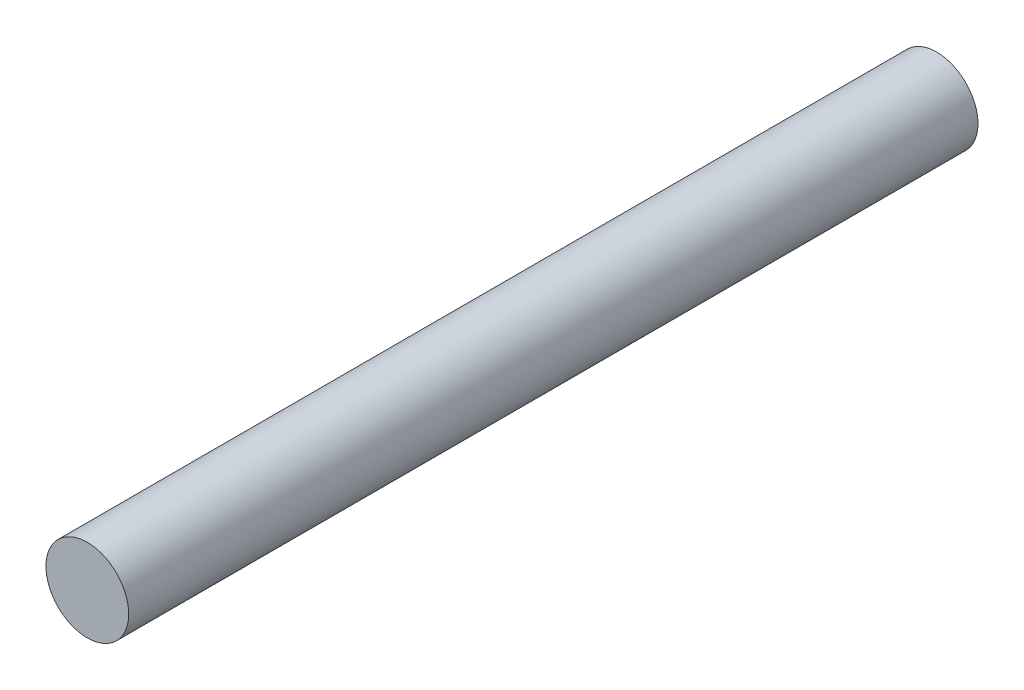
ISO-10303-21;
HEADER;
FILE_DESCRIPTION(('STEP AP214'),'2;1');
FILE_NAME('part.step','',(''),(''),'','','');
FILE_SCHEMA(('AUTOMOTIVE_DESIGN { 1 0 10303 214 1 1 1 1 }'));
ENDSEC;
DATA;
#1=APPLICATION_CONTEXT('core data for automotive mechanical design processes');
#2=APPLICATION_PROTOCOL_DEFINITION('international standard','automotive_design',2000,#1);
#3=PRODUCT_CONTEXT('',#1,'mechanical');
#4=PRODUCT('Part','Part','',(#3));
#5=PRODUCT_RELATED_PRODUCT_CATEGORY('part','',(#4));
#6=PRODUCT_DEFINITION_FORMATION('','',#4);
#7=PRODUCT_DEFINITION_CONTEXT('part definition',#1,'design');
#8=PRODUCT_DEFINITION('design','',#6,#7);
#9=PRODUCT_DEFINITION_SHAPE('','',#8);
#10=(LENGTH_UNIT() NAMED_UNIT(*) SI_UNIT(.MILLI.,.METRE.));
#11=(NAMED_UNIT(*) PLANE_ANGLE_UNIT() SI_UNIT($,.RADIAN.));
#12=(NAMED_UNIT(*) SI_UNIT($,.STERADIAN.) SOLID_ANGLE_UNIT());
#13=UNCERTAINTY_MEASURE_WITH_UNIT(LENGTH_MEASURE(1.E-05),#10,'distance_accuracy_value','');
#14=(GEOMETRIC_REPRESENTATION_CONTEXT(3) GLOBAL_UNCERTAINTY_ASSIGNED_CONTEXT((#13)) GLOBAL_UNIT_ASSIGNED_CONTEXT((#10,
#11,#12)) REPRESENTATION_CONTEXT('',''));
#15=CARTESIAN_POINT('',(0.,0.,0.));
#16=DIRECTION('',(0.,0.,1.));
#17=DIRECTION('',(1.,0.,0.));
#18=AXIS2_PLACEMENT_3D('',#15,#16,#17);
#19=CARTESIAN_POINT('',(0.,0.,-15.113));
#20=DIRECTION('',(0.,0.,1.));
#21=DIRECTION('',(-1.,0.,0.));
#22=AXIS2_PLACEMENT_3D('',#19,#20,#21);
#23=CYLINDRICAL_SURFACE('',#22,0.7366);
#24=CARTESIAN_POINT('',(0.,0.,-15.113));
#25=DIRECTION('',(0.,0.,1.));
#26=DIRECTION('',(1.,0.,0.));
#27=AXIS2_PLACEMENT_3D('',#24,#25,#26);
#28=CIRCLE('',#27,0.7366);
#29=CARTESIAN_POINT('',(0.7366,0.,-15.113));
#30=VERTEX_POINT('',#29);
#31=EDGE_CURVE('E10',#30,#30,#28,.T.);
#32=ORIENTED_EDGE('',*,*,#31,.T.);
#33=EDGE_LOOP('',(#32));
#34=FACE_BOUND('',#33,.T.);
#35=CARTESIAN_POINT('',(0.,0.,0.));
#36=DIRECTION('',(0.,0.,1.));
#37=DIRECTION('',(1.,0.,0.));
#38=AXIS2_PLACEMENT_3D('',#35,#36,#37);
#39=CIRCLE('',#38,0.7366);
#40=CARTESIAN_POINT('',(0.7366,0.,0.));
#41=VERTEX_POINT('',#40);
#42=EDGE_CURVE('E42',#41,#41,#39,.T.);
#43=ORIENTED_EDGE('',*,*,#42,.F.);
#44=EDGE_LOOP('',(#43));
#45=FACE_BOUND('',#44,.T.);
#46=ADVANCED_FACE('F39',(#34,#45),#23,.T.);
#47=CARTESIAN_POINT('',(0.,0.,-15.113));
#48=DIRECTION('',(0.,0.,-1.));
#49=DIRECTION('',(1.,0.,0.));
#50=AXIS2_PLACEMENT_3D('',#47,#48,#49);
#51=PLANE('',#50);
#52=ORIENTED_EDGE('',*,*,#31,.F.);
#53=EDGE_LOOP('',(#52));
#54=FACE_BOUND('',#53,.T.);
#55=ADVANCED_FACE('F54',(#54),#51,.T.);
#56=CARTESIAN_POINT('',(0.,0.,0.));
#57=DIRECTION('',(0.,0.,-1.));
#58=DIRECTION('',(1.,0.,0.));
#59=AXIS2_PLACEMENT_3D('',#56,#57,#58);
#60=PLANE('',#59);
#61=ORIENTED_EDGE('',*,*,#42,.T.);
#62=EDGE_LOOP('',(#61));
#63=FACE_BOUND('',#62,.T.);
#64=ADVANCED_FACE('F51',(#63),#60,.F.);
#65=CLOSED_SHELL('',(#46,#55,#64));
#66=MANIFOLD_SOLID_BREP('B2',#65);
#67=ADVANCED_BREP_SHAPE_REPRESENTATION('',(#18,#66),#14);
#68=SHAPE_DEFINITION_REPRESENTATION(#9,#67);
ENDSEC;
END-ISO-10303-21;
